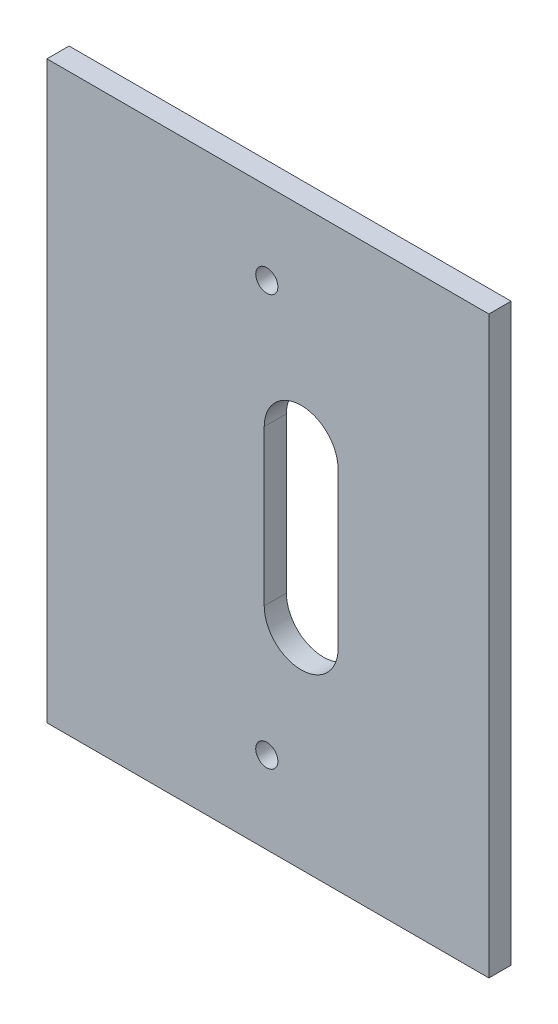
ISO-10303-21;
HEADER;
FILE_DESCRIPTION(('STEP AP214'),'2;1');
FILE_NAME('part.step','',(''),(''),'','','');
FILE_SCHEMA(('AUTOMOTIVE_DESIGN { 1 0 10303 214 1 1 1 1 }'));
ENDSEC;
DATA;
#1=APPLICATION_CONTEXT('core data for automotive mechanical design processes');
#2=APPLICATION_PROTOCOL_DEFINITION('international standard','automotive_design',2000,#1);
#3=PRODUCT_CONTEXT('',#1,'mechanical');
#4=PRODUCT('Part','Part','',(#3));
#5=PRODUCT_RELATED_PRODUCT_CATEGORY('part','',(#4));
#6=PRODUCT_DEFINITION_FORMATION('','',#4);
#7=PRODUCT_DEFINITION_CONTEXT('part definition',#1,'design');
#8=PRODUCT_DEFINITION('design','',#6,#7);
#9=PRODUCT_DEFINITION_SHAPE('','',#8);
#10=(LENGTH_UNIT() NAMED_UNIT(*) SI_UNIT(.MILLI.,.METRE.));
#11=(NAMED_UNIT(*) PLANE_ANGLE_UNIT() SI_UNIT($,.RADIAN.));
#12=(NAMED_UNIT(*) SI_UNIT($,.STERADIAN.) SOLID_ANGLE_UNIT());
#13=UNCERTAINTY_MEASURE_WITH_UNIT(LENGTH_MEASURE(1.E-05),#10,'distance_accuracy_value','');
#14=(GEOMETRIC_REPRESENTATION_CONTEXT(3) GLOBAL_UNCERTAINTY_ASSIGNED_CONTEXT((#13)) GLOBAL_UNIT_ASSIGNED_CONTEXT((#10,
#11,#12)) REPRESENTATION_CONTEXT('',''));
#15=CARTESIAN_POINT('',(0.,0.,0.));
#16=DIRECTION('',(0.,0.,1.));
#17=DIRECTION('',(1.,0.,0.));
#18=AXIS2_PLACEMENT_3D('',#15,#16,#17);
#19=CARTESIAN_POINT('',(29.9,-38.9,3.));
#20=DIRECTION('',(-1.,0.,0.));
#21=DIRECTION('',(0.,0.,1.));
#22=AXIS2_PLACEMENT_3D('',#19,#20,#21);
#23=PLANE('',#22);
#24=DIRECTION('',(0.,1.,0.));
#25=VECTOR('',#24,1.);
#26=CARTESIAN_POINT('',(29.9,-38.9,0.));
#27=LINE('',#26,#25);
#28=CARTESIAN_POINT('',(29.9,-38.9,0.));
#29=VERTEX_POINT('',#28);
#30=CARTESIAN_POINT('',(29.9,38.9,0.));
#31=VERTEX_POINT('',#30);
#32=EDGE_CURVE('E154',#29,#31,#27,.T.);
#33=ORIENTED_EDGE('',*,*,#32,.T.);
#34=DIRECTION('',(0.,0.,-1.));
#35=VECTOR('',#34,1.);
#36=CARTESIAN_POINT('',(29.9,38.9,3.));
#37=LINE('',#36,#35);
#38=CARTESIAN_POINT('',(29.9,38.9,3.));
#39=VERTEX_POINT('',#38);
#40=EDGE_CURVE('E11',#39,#31,#37,.T.);
#41=ORIENTED_EDGE('',*,*,#40,.F.);
#42=DIRECTION('',(0.,1.,0.));
#43=VECTOR('',#42,1.);
#44=CARTESIAN_POINT('',(29.9,-38.9,3.));
#45=LINE('',#44,#43);
#46=CARTESIAN_POINT('',(29.9,-38.9,3.));
#47=VERTEX_POINT('',#46);
#48=EDGE_CURVE('E143',#47,#39,#45,.T.);
#49=ORIENTED_EDGE('',*,*,#48,.F.);
#50=DIRECTION('',(0.,0.,-1.));
#51=VECTOR('',#50,1.);
#52=CARTESIAN_POINT('',(29.9,-38.9,3.));
#53=LINE('',#52,#51);
#54=EDGE_CURVE('E153',#47,#29,#53,.T.);
#55=ORIENTED_EDGE('',*,*,#54,.T.);
#56=EDGE_LOOP('',(#33,#41,#49,#55));
#57=FACE_BOUND('',#56,.T.);
#58=ADVANCED_FACE('F42',(#57),#23,.F.);
#59=CARTESIAN_POINT('',(-29.9,38.9,3.));
#60=DIRECTION('',(0.,-1.,0.));
#61=DIRECTION('',(0.,0.,-1.));
#62=AXIS2_PLACEMENT_3D('',#59,#60,#61);
#63=PLANE('',#62);
#64=DIRECTION('',(-1.,0.,0.));
#65=VECTOR('',#64,1.);
#66=CARTESIAN_POINT('',(-29.9,38.9,0.));
#67=LINE('',#66,#65);
#68=CARTESIAN_POINT('',(-29.9,38.9,0.));
#69=VERTEX_POINT('',#68);
#70=EDGE_CURVE('E157',#31,#69,#67,.T.);
#71=ORIENTED_EDGE('',*,*,#70,.T.);
#72=DIRECTION('',(0.,0.,-1.));
#73=VECTOR('',#72,1.);
#74=CARTESIAN_POINT('',(-29.9,38.9,3.));
#75=LINE('',#74,#73);
#76=CARTESIAN_POINT('',(-29.9,38.9,3.));
#77=VERTEX_POINT('',#76);
#78=EDGE_CURVE('E49',#77,#69,#75,.T.);
#79=ORIENTED_EDGE('',*,*,#78,.F.);
#80=DIRECTION('',(-1.,0.,0.));
#81=VECTOR('',#80,1.);
#82=CARTESIAN_POINT('',(-29.9,38.9,3.));
#83=LINE('',#82,#81);
#84=EDGE_CURVE('E146',#39,#77,#83,.T.);
#85=ORIENTED_EDGE('',*,*,#84,.F.);
#86=ORIENTED_EDGE('',*,*,#40,.T.);
#87=EDGE_LOOP('',(#71,#79,#85,#86));
#88=FACE_BOUND('',#87,.T.);
#89=ADVANCED_FACE('F186',(#88),#63,.F.);
#90=CARTESIAN_POINT('',(-29.9,-38.9,3.));
#91=DIRECTION('',(1.,0.,0.));
#92=DIRECTION('',(0.,0.,-1.));
#93=AXIS2_PLACEMENT_3D('',#90,#91,#92);
#94=PLANE('',#93);
#95=DIRECTION('',(0.,-1.,0.));
#96=VECTOR('',#95,1.);
#97=CARTESIAN_POINT('',(-29.9,-38.9,0.));
#98=LINE('',#97,#96);
#99=CARTESIAN_POINT('',(-29.9,-38.9,0.));
#100=VERTEX_POINT('',#99);
#101=EDGE_CURVE('E160',#69,#100,#98,.T.);
#102=ORIENTED_EDGE('',*,*,#101,.T.);
#103=DIRECTION('',(0.,0.,-1.));
#104=VECTOR('',#103,1.);
#105=CARTESIAN_POINT('',(-29.9,-38.9,3.));
#106=LINE('',#105,#104);
#107=CARTESIAN_POINT('',(-29.9,-38.9,3.));
#108=VERTEX_POINT('',#107);
#109=EDGE_CURVE('E165',#108,#100,#106,.T.);
#110=ORIENTED_EDGE('',*,*,#109,.F.);
#111=DIRECTION('',(0.,-1.,0.));
#112=VECTOR('',#111,1.);
#113=CARTESIAN_POINT('',(-29.9,-38.9,3.));
#114=LINE('',#113,#112);
#115=EDGE_CURVE('E149',#77,#108,#114,.T.);
#116=ORIENTED_EDGE('',*,*,#115,.F.);
#117=ORIENTED_EDGE('',*,*,#78,.T.);
#118=EDGE_LOOP('',(#102,#110,#116,#117));
#119=FACE_BOUND('',#118,.T.);
#120=ADVANCED_FACE('F172',(#119),#94,.F.);
#121=CARTESIAN_POINT('',(-29.9,-38.9,3.));
#122=DIRECTION('',(0.,1.,0.));
#123=DIRECTION('',(0.,0.,1.));
#124=AXIS2_PLACEMENT_3D('',#121,#122,#123);
#125=PLANE('',#124);
#126=DIRECTION('',(1.,0.,0.));
#127=VECTOR('',#126,1.);
#128=CARTESIAN_POINT('',(-29.9,-38.9,0.));
#129=LINE('',#128,#127);
#130=EDGE_CURVE('E147',#100,#29,#129,.T.);
#131=ORIENTED_EDGE('',*,*,#130,.T.);
#132=ORIENTED_EDGE('',*,*,#54,.F.);
#133=DIRECTION('',(1.,0.,0.));
#134=VECTOR('',#133,1.);
#135=CARTESIAN_POINT('',(-29.9,-38.9,3.));
#136=LINE('',#135,#134);
#137=EDGE_CURVE('E151',#108,#47,#136,.T.);
#138=ORIENTED_EDGE('',*,*,#137,.F.);
#139=ORIENTED_EDGE('',*,*,#109,.T.);
#140=EDGE_LOOP('',(#131,#132,#138,#139));
#141=FACE_BOUND('',#140,.T.);
#142=ADVANCED_FACE('F179',(#141),#125,.F.);
#143=CARTESIAN_POINT('',(0.,0.,3.));
#144=DIRECTION('',(0.,0.,-1.));
#145=DIRECTION('',(-1.,0.,0.));
#146=AXIS2_PLACEMENT_3D('',#143,#144,#145);
#147=PLANE('',#146);
#148=CARTESIAN_POINT('',(-0.149999999999853,-27.8,3.));
#149=DIRECTION('',(0.,0.,-1.));
#150=DIRECTION('',(-1.,0.,0.));
#151=AXIS2_PLACEMENT_3D('',#148,#149,#150);
#152=CIRCLE('',#151,1.49999999999999);
#153=CARTESIAN_POINT('',(-1.64999999999985,-27.8,3.));
#154=VERTEX_POINT('',#153);
#155=EDGE_CURVE('E158',#154,#154,#152,.T.);
#156=ORIENTED_EDGE('',*,*,#155,.T.);
#157=EDGE_LOOP('',(#156));
#158=FACE_BOUND('',#157,.T.);
#159=CARTESIAN_POINT('',(-0.149999999999853,27.8,3.));
#160=DIRECTION('',(0.,0.,-1.));
#161=DIRECTION('',(-1.,0.,0.));
#162=AXIS2_PLACEMENT_3D('',#159,#160,#161);
#163=CIRCLE('',#162,1.5);
#164=CARTESIAN_POINT('',(-1.64999999999985,27.8,3.));
#165=VERTEX_POINT('',#164);
#166=EDGE_CURVE('E127',#165,#165,#163,.T.);
#167=ORIENTED_EDGE('',*,*,#166,.T.);
#168=EDGE_LOOP('',(#167));
#169=FACE_BOUND('',#168,.T.);
#170=DIRECTION('',(0.,-1.,0.));
#171=VECTOR('',#170,1.);
#172=CARTESIAN_POINT('',(9.50000000000014,-10.5,3.));
#173=LINE('',#172,#171);
#174=CARTESIAN_POINT('',(9.50000000000014,10.5,3.));
#175=VERTEX_POINT('',#174);
#176=CARTESIAN_POINT('',(9.50000000000014,-10.5,3.));
#177=VERTEX_POINT('',#176);
#178=EDGE_CURVE('E135',#175,#177,#173,.T.);
#179=ORIENTED_EDGE('',*,*,#178,.T.);
#180=CARTESIAN_POINT('',(4.50000000000014,-10.5,3.));
#181=DIRECTION('',(0.,0.,-1.));
#182=DIRECTION('',(1.,0.,0.));
#183=AXIS2_PLACEMENT_3D('',#180,#181,#182);
#184=CIRCLE('',#183,5.);
#185=CARTESIAN_POINT('',(-0.499999999999863,-10.5,3.));
#186=VERTEX_POINT('',#185);
#187=EDGE_CURVE('E108',#177,#186,#184,.T.);
#188=ORIENTED_EDGE('',*,*,#187,.T.);
#189=DIRECTION('',(0.,1.,0.));
#190=VECTOR('',#189,1.);
#191=CARTESIAN_POINT('',(-0.499999999999863,-10.5,3.));
#192=LINE('',#191,#190);
#193=CARTESIAN_POINT('',(-0.499999999999863,10.5,3.));
#194=VERTEX_POINT('',#193);
#195=EDGE_CURVE('E139',#186,#194,#192,.T.);
#196=ORIENTED_EDGE('',*,*,#195,.T.);
#197=CARTESIAN_POINT('',(4.50000000000014,10.5,3.));
#198=DIRECTION('',(0.,0.,-1.));
#199=DIRECTION('',(-1.,0.,0.));
#200=AXIS2_PLACEMENT_3D('',#197,#198,#199);
#201=CIRCLE('',#200,5.);
#202=EDGE_CURVE('E56',#194,#175,#201,.T.);
#203=ORIENTED_EDGE('',*,*,#202,.T.);
#204=EDGE_LOOP('',(#179,#188,#196,#203));
#205=FACE_BOUND('',#204,.T.);
#206=ORIENTED_EDGE('',*,*,#48,.T.);
#207=ORIENTED_EDGE('',*,*,#84,.T.);
#208=ORIENTED_EDGE('',*,*,#115,.T.);
#209=ORIENTED_EDGE('',*,*,#137,.T.);
#210=EDGE_LOOP('',(#206,#207,#208,#209));
#211=FACE_BOUND('',#210,.T.);
#212=ADVANCED_FACE('F185',(#158,#169,#205,#211),#147,.F.);
#213=CARTESIAN_POINT('',(0.,0.,0.));
#214=DIRECTION('',(0.,0.,-1.));
#215=DIRECTION('',(-1.,0.,0.));
#216=AXIS2_PLACEMENT_3D('',#213,#214,#215);
#217=PLANE('',#216);
#218=CARTESIAN_POINT('',(-0.149999999999853,-27.8,0.));
#219=DIRECTION('',(0.,0.,-1.));
#220=DIRECTION('',(-1.,0.,0.));
#221=AXIS2_PLACEMENT_3D('',#218,#219,#220);
#222=CIRCLE('',#221,1.49999999999999);
#223=CARTESIAN_POINT('',(-1.64999999999985,-27.8,0.));
#224=VERTEX_POINT('',#223);
#225=EDGE_CURVE('E227',#224,#224,#222,.T.);
#226=ORIENTED_EDGE('',*,*,#225,.F.);
#227=EDGE_LOOP('',(#226));
#228=FACE_BOUND('',#227,.T.);
#229=CARTESIAN_POINT('',(-0.149999999999853,27.8,0.));
#230=DIRECTION('',(0.,0.,-1.));
#231=DIRECTION('',(-1.,0.,0.));
#232=AXIS2_PLACEMENT_3D('',#229,#230,#231);
#233=CIRCLE('',#232,1.5);
#234=CARTESIAN_POINT('',(-1.64999999999985,27.8,0.));
#235=VERTEX_POINT('',#234);
#236=EDGE_CURVE('E130',#235,#235,#233,.T.);
#237=ORIENTED_EDGE('',*,*,#236,.F.);
#238=EDGE_LOOP('',(#237));
#239=FACE_BOUND('',#238,.T.);
#240=CARTESIAN_POINT('',(4.50000000000014,-10.5,0.));
#241=DIRECTION('',(0.,0.,-1.));
#242=DIRECTION('',(1.,0.,0.));
#243=AXIS2_PLACEMENT_3D('',#240,#241,#242);
#244=CIRCLE('',#243,5.);
#245=CARTESIAN_POINT('',(9.50000000000014,-10.5,0.));
#246=VERTEX_POINT('',#245);
#247=CARTESIAN_POINT('',(-0.499999999999863,-10.5,0.));
#248=VERTEX_POINT('',#247);
#249=EDGE_CURVE('E64',#246,#248,#244,.T.);
#250=ORIENTED_EDGE('',*,*,#249,.F.);
#251=DIRECTION('',(0.,-1.,0.));
#252=VECTOR('',#251,1.);
#253=CARTESIAN_POINT('',(9.50000000000014,-10.5,0.));
#254=LINE('',#253,#252);
#255=CARTESIAN_POINT('',(9.50000000000014,10.5,0.));
#256=VERTEX_POINT('',#255);
#257=EDGE_CURVE('E115',#256,#246,#254,.T.);
#258=ORIENTED_EDGE('',*,*,#257,.F.);
#259=CARTESIAN_POINT('',(4.50000000000014,10.5,0.));
#260=DIRECTION('',(0.,0.,-1.));
#261=DIRECTION('',(-1.,0.,0.));
#262=AXIS2_PLACEMENT_3D('',#259,#260,#261);
#263=CIRCLE('',#262,5.);
#264=CARTESIAN_POINT('',(-0.499999999999863,10.5,0.));
#265=VERTEX_POINT('',#264);
#266=EDGE_CURVE('E120',#265,#256,#263,.T.);
#267=ORIENTED_EDGE('',*,*,#266,.F.);
#268=DIRECTION('',(0.,1.,0.));
#269=VECTOR('',#268,1.);
#270=CARTESIAN_POINT('',(-0.499999999999863,-10.5,0.));
#271=LINE('',#270,#269);
#272=EDGE_CURVE('E126',#248,#265,#271,.T.);
#273=ORIENTED_EDGE('',*,*,#272,.F.);
#274=EDGE_LOOP('',(#250,#258,#267,#273));
#275=FACE_BOUND('',#274,.T.);
#276=ORIENTED_EDGE('',*,*,#32,.F.);
#277=ORIENTED_EDGE('',*,*,#130,.F.);
#278=ORIENTED_EDGE('',*,*,#101,.F.);
#279=ORIENTED_EDGE('',*,*,#70,.F.);
#280=EDGE_LOOP('',(#276,#277,#278,#279));
#281=FACE_BOUND('',#280,.T.);
#282=ADVANCED_FACE('F123',(#228,#239,#275,#281),#217,.T.);
#283=CARTESIAN_POINT('',(4.50000000000014,-10.5,3.));
#284=DIRECTION('',(0.,0.,-1.));
#285=DIRECTION('',(-1.,0.,0.));
#286=AXIS2_PLACEMENT_3D('',#283,#284,#285);
#287=CYLINDRICAL_SURFACE('',#286,5.);
#288=ORIENTED_EDGE('',*,*,#249,.T.);
#289=DIRECTION('',(0.,0.,-1.));
#290=VECTOR('',#289,1.);
#291=CARTESIAN_POINT('',(-0.499999999999863,-10.5,3.));
#292=LINE('',#291,#290);
#293=EDGE_CURVE('E137',#186,#248,#292,.T.);
#294=ORIENTED_EDGE('',*,*,#293,.F.);
#295=ORIENTED_EDGE('',*,*,#187,.F.);
#296=DIRECTION('',(0.,0.,-1.));
#297=VECTOR('',#296,1.);
#298=CARTESIAN_POINT('',(9.50000000000014,-10.5,3.));
#299=LINE('',#298,#297);
#300=EDGE_CURVE('E104',#177,#246,#299,.T.);
#301=ORIENTED_EDGE('',*,*,#300,.T.);
#302=EDGE_LOOP('',(#288,#294,#295,#301));
#303=FACE_BOUND('',#302,.T.);
#304=ADVANCED_FACE('F106',(#303),#287,.F.);
#305=CARTESIAN_POINT('',(9.50000000000014,-10.5,3.));
#306=DIRECTION('',(1.,0.,0.));
#307=DIRECTION('',(0.,0.,-1.));
#308=AXIS2_PLACEMENT_3D('',#305,#306,#307);
#309=PLANE('',#308);
#310=ORIENTED_EDGE('',*,*,#257,.T.);
#311=ORIENTED_EDGE('',*,*,#300,.F.);
#312=ORIENTED_EDGE('',*,*,#178,.F.);
#313=DIRECTION('',(0.,0.,-1.));
#314=VECTOR('',#313,1.);
#315=CARTESIAN_POINT('',(9.50000000000014,10.5,3.));
#316=LINE('',#315,#314);
#317=EDGE_CURVE('E112',#175,#256,#316,.T.);
#318=ORIENTED_EDGE('',*,*,#317,.T.);
#319=EDGE_LOOP('',(#310,#311,#312,#318));
#320=FACE_BOUND('',#319,.T.);
#321=ADVANCED_FACE('F116',(#320),#309,.F.);
#322=CARTESIAN_POINT('',(4.50000000000014,10.5,3.));
#323=DIRECTION('',(0.,0.,-1.));
#324=DIRECTION('',(-1.,0.,0.));
#325=AXIS2_PLACEMENT_3D('',#322,#323,#324);
#326=CYLINDRICAL_SURFACE('',#325,5.);
#327=ORIENTED_EDGE('',*,*,#266,.T.);
#328=ORIENTED_EDGE('',*,*,#317,.F.);
#329=ORIENTED_EDGE('',*,*,#202,.F.);
#330=DIRECTION('',(0.,0.,-1.));
#331=VECTOR('',#330,1.);
#332=CARTESIAN_POINT('',(-0.499999999999863,10.5,3.));
#333=LINE('',#332,#331);
#334=EDGE_CURVE('E234',#194,#265,#333,.T.);
#335=ORIENTED_EDGE('',*,*,#334,.T.);
#336=EDGE_LOOP('',(#327,#328,#329,#335));
#337=FACE_BOUND('',#336,.T.);
#338=ADVANCED_FACE('F204',(#337),#326,.F.);
#339=CARTESIAN_POINT('',(-0.499999999999863,-10.5,3.));
#340=DIRECTION('',(-1.,0.,0.));
#341=DIRECTION('',(0.,0.,1.));
#342=AXIS2_PLACEMENT_3D('',#339,#340,#341);
#343=PLANE('',#342);
#344=ORIENTED_EDGE('',*,*,#272,.T.);
#345=ORIENTED_EDGE('',*,*,#334,.F.);
#346=ORIENTED_EDGE('',*,*,#195,.F.);
#347=ORIENTED_EDGE('',*,*,#293,.T.);
#348=EDGE_LOOP('',(#344,#345,#346,#347));
#349=FACE_BOUND('',#348,.T.);
#350=ADVANCED_FACE('F207',(#349),#343,.F.);
#351=CARTESIAN_POINT('',(-0.149999999999853,27.8,3.));
#352=DIRECTION('',(0.,0.,-1.));
#353=DIRECTION('',(-1.,0.,0.));
#354=AXIS2_PLACEMENT_3D('',#351,#352,#353);
#355=CYLINDRICAL_SURFACE('',#354,1.5);
#356=ORIENTED_EDGE('',*,*,#166,.F.);
#357=EDGE_LOOP('',(#356));
#358=FACE_BOUND('',#357,.T.);
#359=ORIENTED_EDGE('',*,*,#236,.T.);
#360=EDGE_LOOP('',(#359));
#361=FACE_BOUND('',#360,.T.);
#362=ADVANCED_FACE('F210',(#358,#361),#355,.F.);
#363=CARTESIAN_POINT('',(-0.149999999999853,-27.8,3.));
#364=DIRECTION('',(0.,0.,-1.));
#365=DIRECTION('',(-1.,0.,0.));
#366=AXIS2_PLACEMENT_3D('',#363,#364,#365);
#367=CYLINDRICAL_SURFACE('',#366,1.49999999999999);
#368=ORIENTED_EDGE('',*,*,#155,.F.);
#369=EDGE_LOOP('',(#368));
#370=FACE_BOUND('',#369,.T.);
#371=ORIENTED_EDGE('',*,*,#225,.T.);
#372=EDGE_LOOP('',(#371));
#373=FACE_BOUND('',#372,.T.);
#374=ADVANCED_FACE('F216',(#370,#373),#367,.F.);
#375=CLOSED_SHELL('',(#58,#89,#120,#142,#212,#282,#304,#321,#338,#350,#362,#374));
#376=MANIFOLD_SOLID_BREP('B2',#375);
#377=ADVANCED_BREP_SHAPE_REPRESENTATION('',(#18,#376),#14);
#378=SHAPE_DEFINITION_REPRESENTATION(#9,#377);
ENDSEC;
END-ISO-10303-21;
